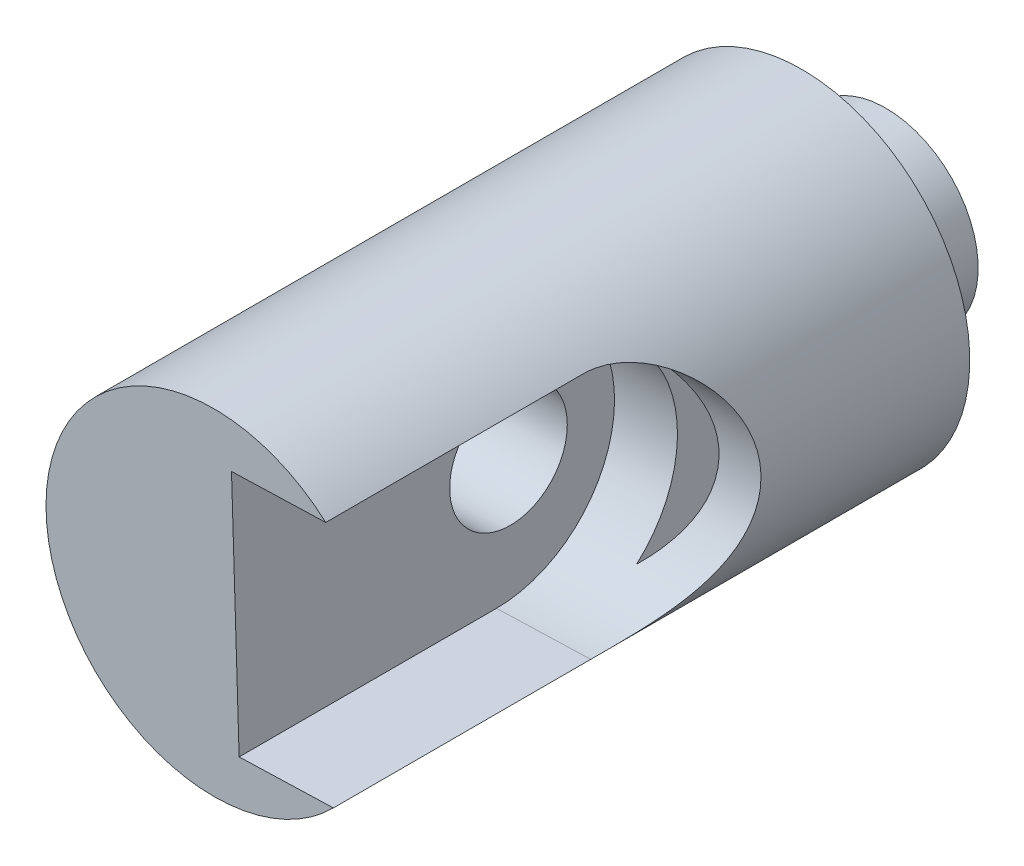
ISO-10303-21;
HEADER;
FILE_DESCRIPTION(('STEP AP214'),'2;1');
FILE_NAME('part.step','',(''),(''),'','','');
FILE_SCHEMA(('AUTOMOTIVE_DESIGN { 1 0 10303 214 1 1 1 1 }'));
ENDSEC;
DATA;
#1=APPLICATION_CONTEXT('core data for automotive mechanical design processes');
#2=APPLICATION_PROTOCOL_DEFINITION('international standard','automotive_design',2000,#1);
#3=PRODUCT_CONTEXT('',#1,'mechanical');
#4=PRODUCT('Part','Part','',(#3));
#5=PRODUCT_RELATED_PRODUCT_CATEGORY('part','',(#4));
#6=PRODUCT_DEFINITION_FORMATION('','',#4);
#7=PRODUCT_DEFINITION_CONTEXT('part definition',#1,'design');
#8=PRODUCT_DEFINITION('design','',#6,#7);
#9=PRODUCT_DEFINITION_SHAPE('','',#8);
#10=(LENGTH_UNIT() NAMED_UNIT(*) SI_UNIT(.MILLI.,.METRE.));
#11=(NAMED_UNIT(*) PLANE_ANGLE_UNIT() SI_UNIT($,.RADIAN.));
#12=(NAMED_UNIT(*) SI_UNIT($,.STERADIAN.) SOLID_ANGLE_UNIT());
#13=UNCERTAINTY_MEASURE_WITH_UNIT(LENGTH_MEASURE(1.E-05),#10,'distance_accuracy_value','');
#14=(GEOMETRIC_REPRESENTATION_CONTEXT(3) GLOBAL_UNCERTAINTY_ASSIGNED_CONTEXT((#13)) GLOBAL_UNIT_ASSIGNED_CONTEXT((#10,
#11,#12)) REPRESENTATION_CONTEXT('',''));
#15=CARTESIAN_POINT('',(0.,0.,0.));
#16=DIRECTION('',(0.,0.,1.));
#17=DIRECTION('',(1.,0.,0.));
#18=AXIS2_PLACEMENT_3D('',#15,#16,#17);
#19=CARTESIAN_POINT('',(0.,0.,20.));
#20=DIRECTION('',(0.,0.,-1.));
#21=DIRECTION('',(-1.,0.,0.));
#22=AXIS2_PLACEMENT_3D('',#19,#20,#21);
#23=CYLINDRICAL_SURFACE('',#22,20.);
#24=CARTESIAN_POINT('',(-20.,0.,44.4453552428067));
#25=CARTESIAN_POINT('',(-20.0000004425085,-0.187842317648547,44.4622486388017));
#26=CARTESIAN_POINT('',(-19.9973479865868,-0.376357770084538,44.4715577425075));
#27=CARTESIAN_POINT('',(-19.9866952425686,-0.753370980419799,44.4749220013045));
#28=CARTESIAN_POINT('',(-19.9786951875228,-0.941868738732161,44.4689778211084));
#29=CARTESIAN_POINT('',(-19.9574482051852,-1.31743445444334,44.4418958961847));
#30=CARTESIAN_POINT('',(-19.9442022247151,-1.5045026636504,44.420760892644));
#31=CARTESIAN_POINT('',(-19.9127024154437,-1.87590448718318,44.3635024894667));
#32=CARTESIAN_POINT('',(-19.8944484825018,-2.0602380445576,44.327378778131));
#33=CARTESIAN_POINT('',(-19.8533327369456,-2.42461292223825,44.2405413125127));
#34=CARTESIAN_POINT('',(-19.830477811978,-2.60466021378754,44.1898493188941));
#35=CARTESIAN_POINT('',(-19.7806169378885,-2.95961626424364,44.0742772385948));
#36=CARTESIAN_POINT('',(-19.7536095353423,-3.13452319832323,44.0093921807725));
#37=CARTESIAN_POINT('',(-19.6960350370607,-3.47800605594235,43.8659880476057));
#38=CARTESIAN_POINT('',(-19.6654685600243,-3.64658307313776,43.7874713407851));
#39=CARTESIAN_POINT('',(-19.6014203644443,-3.97650253583233,43.6173604119971));
#40=CARTESIAN_POINT('',(-19.5679375377582,-4.13784219572114,43.5257612104648));
#41=CARTESIAN_POINT('',(-19.4978570593219,-4.45655780838578,43.3275080150709));
#42=CARTESIAN_POINT('',(-19.4611997578929,-4.61370952767202,43.2205146393983));
#43=CARTESIAN_POINT('',(-19.3864087323906,-4.91851553225404,42.9941239885198));
#44=CARTESIAN_POINT('',(-19.348274504686,-5.06616653130893,42.8747224583573));
#45=CARTESIAN_POINT('',(-19.2714143808507,-5.3511090427189,42.6242857420295));
#46=CARTESIAN_POINT('',(-19.2326884253011,-5.48839950637985,42.4932493810999));
#47=CARTESIAN_POINT('',(-19.1555521145922,-5.75184018205733,42.2203327183977));
#48=CARTESIAN_POINT('',(-19.1171417648495,-5.87799020323072,42.0784522309357));
#49=CARTESIAN_POINT('',(-19.0398333152716,-6.12389655937456,41.7779712628929));
#50=CARTESIAN_POINT('',(-19.0009924994253,-6.24310107158371,41.6189038044488));
#51=CARTESIAN_POINT('',(-18.9257194231206,-6.46770231550239,41.2908468168133));
#52=CARTESIAN_POINT('',(-18.889286326486,-6.57310385345954,41.1218607711526));
#53=CARTESIAN_POINT('',(-18.8198256674173,-6.76941737246106,40.7749235903295));
#54=CARTESIAN_POINT('',(-18.7867991980358,-6.86032470796089,40.5969696048027));
#55=CARTESIAN_POINT('',(-18.7251523904139,-7.02684519909863,40.2333990499313));
#56=CARTESIAN_POINT('',(-18.6965301029811,-7.10246512527972,40.0477859167489));
#57=CARTESIAN_POINT('',(-18.6449800817636,-7.23669866968002,39.6731799048455));
#58=CARTESIAN_POINT('',(-18.6219677447739,-7.29556752629745,39.4842902206943));
#59=CARTESIAN_POINT('',(-18.5817780510421,-7.39733207745742,39.1017274987091));
#60=CARTESIAN_POINT('',(-18.5645982165536,-7.44023455553678,38.90805652965));
#61=CARTESIAN_POINT('',(-18.5366232396813,-7.50966064322653,38.5173813813477));
#62=CARTESIAN_POINT('',(-18.5258268439217,-7.53618746820981,38.3203778642628));
#63=CARTESIAN_POINT('',(-18.510976756472,-7.57259074419938,37.9245890617415));
#64=CARTESIAN_POINT('',(-18.5069227286574,-7.58246802522857,37.7258038656231));
#65=CARTESIAN_POINT('',(-18.5057286987945,-7.58538070824602,37.3396321654185));
#66=CARTESIAN_POINT('',(-18.5082013399477,-7.57935966589449,37.1522532163115));
#67=CARTESIAN_POINT('',(-18.5191755237654,-7.55250613452933,36.7786728258887));
#68=CARTESIAN_POINT('',(-18.52767909289,-7.53166866702293,36.5924718015924));
#69=CARTESIAN_POINT('',(-18.5504587030862,-7.47538626008476,36.2227225198607));
#70=CARTESIAN_POINT('',(-18.564732671348,-7.43994656589368,36.0391733343428));
#71=CARTESIAN_POINT('',(-18.5986419715913,-7.35476820506289,35.6758599496136));
#72=CARTESIAN_POINT('',(-18.6182793341409,-7.30502412243854,35.4960972117624));
#73=CARTESIAN_POINT('',(-18.6622201503578,-7.19202241776985,35.1427160171791));
#74=CARTESIAN_POINT('',(-18.6864937640135,-7.12885093904556,34.9690662522644));
#75=CARTESIAN_POINT('',(-18.7391431340398,-6.98928288868735,34.6277455086868));
#76=CARTESIAN_POINT('',(-18.7675202730567,-6.91288185775364,34.4600765690436));
#77=CARTESIAN_POINT('',(-18.8276441067695,-6.74741152445584,34.1317388391623));
#78=CARTESIAN_POINT('',(-18.8593909167536,-6.65834178861572,33.9710702886972));
#79=CARTESIAN_POINT('',(-18.9254761558097,-6.46811319023259,33.6576134899818));
#80=CARTESIAN_POINT('',(-18.9598147129255,-6.36695373025924,33.5048256317012));
#81=CARTESIAN_POINT('',(-19.0322241059532,-6.14723919678313,33.1997370283242));
#82=CARTESIAN_POINT('',(-19.0703963291228,-6.0280317560531,33.0479297448386));
#83=CARTESIAN_POINT('',(-19.1477532775103,-5.77760421368913,32.7549329341111));
#84=CARTESIAN_POINT('',(-19.1869377038944,-5.64638762908107,32.613740320156));
#85=CARTESIAN_POINT('',(-19.2653954799569,-5.37259928985253,32.3426818628677));
#86=CARTESIAN_POINT('',(-19.3046688680618,-5.23002098494293,32.2128226452069));
#87=CARTESIAN_POINT('',(-19.3823258370079,-4.93444853863428,31.9653794613248));
#88=CARTESIAN_POINT('',(-19.4207097374643,-4.78145821883944,31.8477910309774));
#89=CARTESIAN_POINT('',(-19.4969159976444,-4.46075117757021,31.6219969048384));
#90=CARTESIAN_POINT('',(-19.5346793951948,-4.29271718014562,31.51422129239));
#91=CARTESIAN_POINT('',(-19.6073424782124,-3.94755730983951,31.3134012387409));
#92=CARTESIAN_POINT('',(-19.6422432153564,-3.77043481509384,31.2203513758498));
#93=CARTESIAN_POINT('',(-19.7083208385631,-3.40822165234605,31.0497171116618));
#94=CARTESIAN_POINT('',(-19.7394978141975,-3.22313117615205,30.9721323383365));
#95=CARTESIAN_POINT('',(-19.7973471217223,-2.84629157350414,30.8331385997147));
#96=CARTESIAN_POINT('',(-19.8240196609048,-2.65454275395385,30.7717288899767));
#97=CARTESIAN_POINT('',(-19.8713498027469,-2.27269692777012,30.6675625924604));
#98=CARTESIAN_POINT('',(-19.8921866419919,-2.08278096791077,30.6242235665512));
#99=CARTESIAN_POINT('',(-19.9285917012608,-1.69949508475586,30.553582359667));
#100=CARTESIAN_POINT('',(-19.9441601627417,-1.50612532018061,30.526279443693));
#101=CARTESIAN_POINT('',(-19.9697072641949,-1.11745754217882,30.4879916762449));
#102=CARTESIAN_POINT('',(-19.9796872685388,-0.922160011258233,30.4770028407519));
#103=CARTESIAN_POINT('',(-19.9939035380252,-0.531125242789311,30.4714459366874));
#104=CARTESIAN_POINT('',(-19.9981399689363,-0.335388018094561,30.4768773941859));
#105=CARTESIAN_POINT('',(-20.0008151074168,0.0461301811576558,30.5034841496923));
#106=CARTESIAN_POINT('',(-19.9995078082466,0.231960431698232,30.5239349561457));
#107=CARTESIAN_POINT('',(-19.9918109889907,0.601358751435242,30.5795645073583));
#108=CARTESIAN_POINT('',(-19.9854197879935,0.784926052034582,30.6147481214643));
#109=CARTESIAN_POINT('',(-19.9678309595264,1.14840131829595,30.6995099161634));
#110=CARTESIAN_POINT('',(-19.9566349478322,1.32831049284023,30.7490832559257));
#111=CARTESIAN_POINT('',(-19.9298235043089,1.68340532265036,30.8622222606848));
#112=CARTESIAN_POINT('',(-19.9142064025106,1.85858916558709,30.9257932109499));
#113=CARTESIAN_POINT('',(-19.8788712817774,2.20478030786975,31.0671074906898));
#114=CARTESIAN_POINT('',(-19.859113734394,2.37572815912303,31.1449864626371));
#115=CARTESIAN_POINT('',(-19.816183202839,2.71060774696668,31.3139150383926));
#116=CARTESIAN_POINT('',(-19.793009053564,2.87453706544563,31.4049691348833));
#117=CARTESIAN_POINT('',(-19.7439154497925,3.19436735185186,31.5995909866095));
#118=CARTESIAN_POINT('',(-19.7179958379482,3.3502678588709,31.7031594591155));
#119=CARTESIAN_POINT('',(-19.6641332066412,3.65315358475751,31.9221336628987));
#120=CARTESIAN_POINT('',(-19.636190102185,3.8001384286607,32.0375398914856));
#121=CARTESIAN_POINT('',(-19.5775728854349,4.09168315743354,32.2857143966127));
#122=CARTESIAN_POINT('',(-19.5468322246188,4.23572998265468,32.4190702115792));
#123=CARTESIAN_POINT('',(-19.4848859138111,4.51212570671846,32.6972120316108));
#124=CARTESIAN_POINT('',(-19.4536804084562,4.64447815895493,32.841994539127));
#125=CARTESIAN_POINT('',(-19.3917139869664,4.89676569472088,33.1422413347341));
#126=CARTESIAN_POINT('',(-19.3609533383708,5.01669355309364,33.29771175162));
#127=CARTESIAN_POINT('',(-19.300847988743,5.24318549800075,33.6182693712837));
#128=CARTESIAN_POINT('',(-19.2715027471389,5.34975471172978,33.7833528486139));
#129=CARTESIAN_POINT('',(-19.2145395606266,5.55091281534335,34.1257898058144));
#130=CARTESIAN_POINT('',(-19.186971443992,5.64519971119619,34.3033292512507));
#131=CARTESIAN_POINT('',(-19.1352074494636,5.81824675395876,34.6662134438202));
#132=CARTESIAN_POINT('',(-19.1110102593424,5.89701294771221,34.8515551169247));
#133=CARTESIAN_POINT('',(-19.0668340012976,6.03832146773355,35.228783816917));
#134=CARTESIAN_POINT('',(-19.0468542478962,6.10086643088447,35.4206697742366));
#135=CARTESIAN_POINT('',(-19.0118440355184,6.20910858837416,35.8095765416302));
#136=CARTESIAN_POINT('',(-18.9968132946458,6.25480674232602,36.0065970585494));
#137=CARTESIAN_POINT('',(-18.9728452401336,6.32712610596551,36.3949176531306));
#138=CARTESIAN_POINT('',(-18.963656078456,6.35453875275758,36.5860550183904));
#139=CARTESIAN_POINT('',(-18.9506195510184,6.39331218425049,36.9701293937795));
#140=CARTESIAN_POINT('',(-18.9467719545082,6.40467366234641,37.1630663258068));
#141=CARTESIAN_POINT('',(-18.9445572804337,6.41122149988655,37.5492058994828));
#142=CARTESIAN_POINT('',(-18.946189089437,6.40641114549786,37.742408479176));
#143=CARTESIAN_POINT('',(-18.954871922654,6.38067508095389,38.127611403835));
#144=CARTESIAN_POINT('',(-18.9619228452211,6.35974967306953,38.3196117712826));
#145=CARTESIAN_POINT('',(-18.9807796833874,6.3032407777504,38.6928133698873));
#146=CARTESIAN_POINT('',(-18.9923703385138,6.26831939837363,38.8741263112877));
#147=CARTESIAN_POINT('',(-19.0199178616885,6.18422836461464,39.233139171186));
#148=CARTESIAN_POINT('',(-19.0358761669072,6.13505401999495,39.4108378797118));
#149=CARTESIAN_POINT('',(-19.0716548479018,6.02290962353986,39.7613767260397));
#150=CARTESIAN_POINT('',(-19.0914743540486,5.95994267771157,39.9342179478456));
#151=CARTESIAN_POINT('',(-19.1343877774663,5.82069670661995,40.2741018914461));
#152=CARTESIAN_POINT('',(-19.1574829416179,5.74441260961226,40.4411423749064));
#153=CARTESIAN_POINT('',(-19.2070080731507,5.5766224911515,40.7733498303754));
#154=CARTESIAN_POINT('',(-19.2335176942802,5.48472630668514,40.9383078352385));
#155=CARTESIAN_POINT('',(-19.2885143792602,5.28806557501069,41.260090991388));
#156=CARTESIAN_POINT('',(-19.3170021213477,5.1832966045513,41.4169133206809));
#157=CARTESIAN_POINT('',(-19.3751289649182,4.96160319837589,41.7215086280053));
#158=CARTESIAN_POINT('',(-19.404768165151,4.84467771866269,41.8692808270798));
#159=CARTESIAN_POINT('',(-19.4643631713367,4.59940133378802,42.1549512552404));
#160=CARTESIAN_POINT('',(-19.4943189867116,4.47105008776591,42.2928491895296));
#161=CARTESIAN_POINT('',(-19.555367208684,4.19624851744786,42.5653620592461));
#162=CARTESIAN_POINT('',(-19.5864304355603,4.049189067364,42.699370120428));
#163=CARTESIAN_POINT('',(-19.6470207188208,3.74416133685337,42.9546108035918));
#164=CARTESIAN_POINT('',(-19.6765482718102,3.58619662190869,43.0758475687164));
#165=CARTESIAN_POINT('',(-19.7331789038552,3.26021878628325,43.3048214815837));
#166=CARTESIAN_POINT('',(-19.7602806384983,3.0922001786456,43.4125511566546));
#167=CARTESIAN_POINT('',(-19.8111691286383,2.74735145956625,43.6135799664951));
#168=CARTESIAN_POINT('',(-19.8349572204013,2.57052493930239,43.706884919883));
#169=CARTESIAN_POINT('',(-19.8791917027731,2.20298670980996,43.8812930719595));
#170=CARTESIAN_POINT('',(-19.8994956314593,2.0120068245095,43.9618685199997));
#171=CARTESIAN_POINT('',(-19.9349635513935,1.6233558288528,44.1060179677271));
#172=CARTESIAN_POINT('',(-19.9501296444361,1.42568749110642,44.1695989173007));
#173=CARTESIAN_POINT('',(-19.9747134597499,1.02521095713032,44.2791353504175));
#174=CARTESIAN_POINT('',(-19.9841322668428,0.822403738415282,44.3250941595964));
#175=CARTESIAN_POINT('',(-19.9967749928722,0.413336805960365,44.3988915853585));
#176=CARTESIAN_POINT('',(-19.9999995121784,0.207077428769365,44.4267319578643));
#177=CARTESIAN_POINT('',(-20.,0.,44.4453552428067));
#178=B_SPLINE_CURVE_WITH_KNOTS('',3,(#24,#25,#26,#27,#28,#29,#30,#31,#32,#33,#34,#35,#36,#37,
#38,#39,#40,#41,#42,#43,#44,#45,#46,#47,#48,#49,#50,#51,#52,#53,#54,#55,#56,#57,#58,#59,#60,#61,
#62,#63,#64,#65,#66,#67,#68,#69,#70,#71,#72,#73,#74,#75,#76,#77,#78,#79,#80,#81,#82,#83,#84,#85,
#86,#87,#88,#89,#90,#91,#92,#93,#94,#95,#96,#97,#98,#99,#100,#101,#102,#103,#104,#105,#106,#107,
#108,#109,#110,#111,#112,#113,#114,#115,#116,#117,#118,#119,#120,#121,#122,#123,#124,#125,#126,
#127,#128,#129,#130,#131,#132,#133,#134,#135,#136,#137,#138,#139,#140,#141,#142,#143,#144,#145,
#146,#147,#148,#149,#150,#151,#152,#153,#154,#155,#156,#157,#158,#159,#160,#161,#162,#163,#164,
#165,#166,#167,#168,#169,#170,#171,#172,#173,#174,#175,#176,#177),.UNSPECIFIED.,.T.,.F.,(4,2,2,
2,2,2,2,2,2,2,2,2,2,2,2,2,2,2,2,2,2,2,2,2,2,2,2,2,2,2,2,2,2,2,2,2,2,2,2,2,2,2,2,2,2,2,2,2,2,2,2,
2,2,2,2,2,2,2,2,2,2,2,2,2,2,2,2,2,2,2,2,2,2,2,2,2,4),(0.,0.565612600450699,1.13120055286283,
1.69668647043877,2.26218414821952,2.82684149291637,3.3916969272625,3.95645431498994,
4.52142724096915,5.10163645735189,5.68204529753223,6.26251280815551,6.84299026064206,
7.44987125075371,8.05654035753135,8.66340351895711,9.26999731896564,9.86678171996489,
10.4633122786044,11.0597256706943,11.6561093291519,12.2179044889435,12.7798885077621,
13.341670833016,13.9036661432326,14.4621592978712,15.0208410721742,15.5795419670941,
16.1382704824114,16.7278737052541,17.3173048047135,17.907078217843,18.4966363172065,
19.1053876502428,19.7139143306461,20.3224263705592,20.9309103994065,21.5178934788621,
22.1048496524401,22.6916624633942,23.2784583376475,23.8386669469475,24.3990608573674,
24.9592664643821,25.5196839596929,26.0857176108997,26.6519447349531,27.2182043281335,
27.7844877198992,28.379880941623,28.9750926234791,29.5706485129197,30.1659751169845,
30.7739267835333,31.3816411226133,31.9892566111504,32.5968374838797,33.1760358589708,
33.7552092124834,34.3342648832683,34.9133096929398,35.4676977853836,36.0222685183936,
36.5767144937162,37.1313720884272,37.70278217372,38.2743891547047,38.8460452657296,
39.4177184364781,40.0211166295611,40.6243184671509,41.2278525616566,41.8311425648454,
42.4551078389825,43.0788175512526,43.7024094995433,44.3259410043026),.UNSPECIFIED.);
#179=CARTESIAN_POINT('',(-20.,0.,44.4453552428067));
#180=VERTEX_POINT('',#179);
#181=EDGE_CURVE('E118',#180,#180,#178,.T.);
#182=ORIENTED_EDGE('',*,*,#181,.T.);
#183=EDGE_LOOP('',(#182));
#184=FACE_BOUND('',#183,.T.);
#185=CARTESIAN_POINT('',(0.,0.,0.));
#186=DIRECTION('',(0.,0.,-1.));
#187=DIRECTION('',(-1.,0.,0.));
#188=AXIS2_PLACEMENT_3D('',#185,#186,#187);
#189=CIRCLE('',#188,20.);
#190=CARTESIAN_POINT('',(-20.,0.,0.));
#191=VERTEX_POINT('',#190);
#192=EDGE_CURVE('E164',#191,#191,#189,.T.);
#193=ORIENTED_EDGE('',*,*,#192,.F.);
#194=EDGE_LOOP('',(#193));
#195=FACE_BOUND('',#194,.T.);
#196=DIRECTION('',(0.,0.,-1.));
#197=VECTOR('',#196,1.);
#198=CARTESIAN_POINT('',(13.3134153599734,14.9249111036825,20.));
#199=LINE('',#198,#197);
#200=CARTESIAN_POINT('',(13.3134153599734,14.9249111036825,39.3520492179967));
#201=VERTEX_POINT('',#200);
#202=CARTESIAN_POINT('',(13.3134153599734,14.9249111036825,70.));
#203=VERTEX_POINT('',#202);
#204=EDGE_CURVE('E204',#201,#203,#199,.F.);
#205=ORIENTED_EDGE('',*,*,#204,.F.);
#206=CARTESIAN_POINT('',(14.2229850730889,-14.0608212992944,39.3520492179967));
#207=CARTESIAN_POINT('',(14.2229742516631,-14.0608252162982,39.1788726272704));
#208=CARTESIAN_POINT('',(14.2261536725214,-14.0576169128227,39.0057285004978));
#209=CARTESIAN_POINT('',(14.2387875506655,-14.0448228602102,38.6599292792115));
#210=CARTESIAN_POINT('',(14.2482411193572,-14.0352380141687,38.4872741189236));
#211=CARTESIAN_POINT('',(14.2858043099041,-13.9970406228329,37.9713184520857));
#212=CARTESIAN_POINT('',(14.3231172947011,-13.9589848003908,37.6293065912887));
#213=CARTESIAN_POINT('',(14.4196301427622,-13.8592551180275,36.9562449863149));
#214=CARTESIAN_POINT('',(14.4785654735911,-13.7978664039677,36.6251133755812));
#215=CARTESIAN_POINT('',(14.6154882648255,-13.6527444643762,35.9717147558904));
#216=CARTESIAN_POINT('',(14.6934835322058,-13.5690020814517,35.6494514397315));
#217=CARTESIAN_POINT('',(14.8646329220778,-13.3812809019901,35.0177311526619));
#218=CARTESIAN_POINT('',(14.9576758589029,-13.2774495128835,34.7081996913881));
#219=CARTESIAN_POINT('',(15.1560943983499,-13.0504983933531,34.1004554156212));
#220=CARTESIAN_POINT('',(15.261469004089,-12.9273802217862,33.8022416887884));
#221=CARTESIAN_POINT('',(15.4819160474535,-12.6625450581384,33.2166420512385));
#222=CARTESIAN_POINT('',(15.5970188694741,-12.5207689608864,32.9292944517162));
#223=CARTESIAN_POINT('',(15.8338971861107,-12.219835637883,32.3666901071255));
#224=CARTESIAN_POINT('',(15.9556736623564,-12.0606758517225,32.0914351515532));
#225=CARTESIAN_POINT('',(16.226952382073,-11.6939055001407,31.5021392222547));
#226=CARTESIAN_POINT('',(16.3773301696802,-11.4828325073476,31.1906521944178));
#227=CARTESIAN_POINT('',(16.6803557764098,-11.0380333708868,30.5854648550631));
#228=CARTESIAN_POINT('',(16.8330037668058,-10.8043055106249,30.2917658941185));
#229=CARTESIAN_POINT('',(17.137350205493,-10.3147629113583,29.7225626540737));
#230=CARTESIAN_POINT('',(17.2890481592706,-10.0589375534654,29.4470672361297));
#231=CARTESIAN_POINT('',(17.588387454925,-9.52586484491617,28.915223029932));
#232=CARTESIAN_POINT('',(17.736028488827,-9.2486158739758,28.6588756927511));
#233=CARTESIAN_POINT('',(18.051110200722,-8.6199107573052,28.1207693386892));
#234=CARTESIAN_POINT('',(18.2171504665529,-8.2642235617562,27.8431032444655));
#235=CARTESIAN_POINT('',(18.5348800140265,-7.52464136141697,27.3185601990681));
#236=CARTESIAN_POINT('',(18.6865663617751,-7.14074061823613,27.0716895391131));
#237=CARTESIAN_POINT('',(18.9707971749197,-6.34714179324637,26.6121072303389));
#238=CARTESIAN_POINT('',(19.1033721651489,-5.93748638460798,26.3993410472971));
#239=CARTESIAN_POINT('',(19.3452417342202,-5.09447125889797,26.0108958807035));
#240=CARTESIAN_POINT('',(19.4545474925083,-4.6611230511179,25.8351990879348));
#241=CARTESIAN_POINT('',(19.6185518858174,-3.9009759335107,25.568663680394));
#242=CARTESIAN_POINT('',(19.6799327735312,-3.57905313922842,25.4679162542034));
#243=CARTESIAN_POINT('',(19.7874604748604,-2.92670355892603,25.2882709116741));
#244=CARTESIAN_POINT('',(19.8336107142168,-2.59627870327357,25.2093680826014));
#245=CARTESIAN_POINT('',(19.9095707486004,-1.92915246853047,25.0744870176294));
#246=CARTESIAN_POINT('',(19.9393913988023,-1.5924554132407,25.0184935588891));
#247=CARTESIAN_POINT('',(19.9819474114525,-0.914875357930566,24.9301555586054));
#248=CARTESIAN_POINT('',(19.9946821773973,-0.573992212184425,24.8978118427413));
#249=CARTESIAN_POINT('',(20.0026289283924,0.110198189156131,24.8572232408401));
#250=CARTESIAN_POINT('',(19.9978008380042,0.453509202504801,24.8490335472916));
#251=CARTESIAN_POINT('',(19.9704799472305,1.13913987140963,24.8570379617273));
#252=CARTESIAN_POINT('',(19.9479872144359,1.48145953075402,24.8732319764112));
#253=CARTESIAN_POINT('',(19.8856795076763,2.16257607902138,24.9297571152173));
#254=CARTESIAN_POINT('',(19.8458607239327,2.50137217637208,24.9700935486837));
#255=CARTESIAN_POINT('',(19.7496244905673,3.1729163806598,25.0743015337017));
#256=CARTESIAN_POINT('',(19.6932070864884,3.50566450418848,25.1381730206784));
#257=CARTESIAN_POINT('',(19.5666553418221,4.15353206016148,25.2864010004799));
#258=CARTESIAN_POINT('',(19.4969584479696,4.46888358065249,25.3701208093543));
#259=CARTESIAN_POINT('',(19.3440778699862,5.09008591124062,25.5579003160905));
#260=CARTESIAN_POINT('',(19.2608945367896,5.39593696830518,25.6619594847108));
#261=CARTESIAN_POINT('',(19.0823814799642,5.99674420444995,25.8892977578089));
#262=CARTESIAN_POINT('',(18.9870512984494,6.29169997228178,26.0125775868654));
#263=CARTESIAN_POINT('',(18.7856842805064,6.8696239310993,26.2772053175312));
#264=CARTESIAN_POINT('',(18.6796459983576,7.15259049605957,26.4185556595611));
#265=CARTESIAN_POINT('',(18.4461230744592,7.73627632375103,26.7347681184986));
#266=CARTESIAN_POINT('',(18.3175637190501,8.03549423329144,26.9116077613891));
#267=CARTESIAN_POINT('',(18.0512033154427,8.61721678906266,27.284711766236));
#268=CARTESIAN_POINT('',(17.9134016878586,8.89972038540185,27.4809773463464));
#269=CARTESIAN_POINT('',(17.630576567516,9.44763936888886,27.8918002459784));
#270=CARTESIAN_POINT('',(17.4855476497817,9.71304156596976,28.1063713947928));
#271=CARTESIAN_POINT('',(17.190514911579,10.226133072023,28.5525969011265));
#272=CARTESIAN_POINT('',(17.0405106317487,10.4738207387598,28.7842528384677));
#273=CARTESIAN_POINT('',(16.709214005781,10.9961328493966,29.3089375340305));
#274=CARTESIAN_POINT('',(16.5273492479327,11.2670460803354,29.6053085376159));
#275=CARTESIAN_POINT('',(16.1635848960846,11.7829609653443,30.2198816395311));
#276=CARTESIAN_POINT('',(15.9816853025189,12.0279573406128,30.5380881636903));
#277=CARTESIAN_POINT('',(15.6220366064849,12.4915198461408,31.1957632334522));
#278=CARTESIAN_POINT('',(15.4442899662063,12.7100706029458,31.5352439738678));
#279=CARTESIAN_POINT('',(15.0979039524274,13.1196485337919,32.234780466507));
#280=CARTESIAN_POINT('',(14.9292620615335,13.310683340401,32.5948304742303));
#281=CARTESIAN_POINT('',(14.6418180167776,13.625424708758,33.2543626297598));
#282=CARTESIAN_POINT('',(14.5201652980134,13.7547301163222,33.5499377150378));
#283=CARTESIAN_POINT('',(14.288841374921,13.9948849174948,34.153105935016));
#284=CARTESIAN_POINT('',(14.1791701415475,14.1057343558443,34.4606990405799));
#285=CARTESIAN_POINT('',(13.9755340756635,14.3075130933872,35.0859909170404));
#286=CARTESIAN_POINT('',(13.8815092819848,14.3985188753983,35.4036452819232));
#287=CARTESIAN_POINT('',(13.7121087237221,14.5599383579117,36.0489875042493));
#288=CARTESIAN_POINT('',(13.636725945892,14.6303598041934,36.3766715361709));
#289=CARTESIAN_POINT('',(13.530576381928,14.7284320619454,36.9232407815772));
#290=CARTESIAN_POINT('',(13.4934476604954,14.7624104905191,37.1397834498503));
#291=CARTESIAN_POINT('',(13.4291383916239,14.8209355051492,37.5755721503367));
#292=CARTESIAN_POINT('',(13.4019553661671,14.8454844406852,37.7948174950734));
#293=CARTESIAN_POINT('',(13.3580313721728,14.8850236341804,38.2364902437317));
#294=CARTESIAN_POINT('',(13.3413509504038,14.8999584784369,38.4589286712042));
#295=CARTESIAN_POINT('',(13.3190165356937,14.9199141789906,38.9049207788461));
#296=CARTESIAN_POINT('',(13.3133685835636,14.9249296039442,39.1284750028477));
#297=CARTESIAN_POINT('',(13.3134153599734,14.9249111036825,39.3520492179967));
#298=B_SPLINE_CURVE_WITH_KNOTS('',3,(#206,#207,#208,#209,#210,#211,#212,#213,#214,#215,#216,
#217,#218,#219,#220,#221,#222,#223,#224,#225,#226,#227,#228,#229,#230,#231,#232,#233,#234,#235,
#236,#237,#238,#239,#240,#241,#242,#243,#244,#245,#246,#247,#248,#249,#250,#251,#252,#253,#254,
#255,#256,#257,#258,#259,#260,#261,#262,#263,#264,#265,#266,#267,#268,#269,#270,#271,#272,#273,
#274,#275,#276,#277,#278,#279,#280,#281,#282,#283,#284,#285,#286,#287,#288,#289,#290,#291,#292,
#293,#294,#295,#296,#297),.UNSPECIFIED.,.F.,.F.,(4,2,2,2,2,2,2,2,2,2,2,2,2,2,2,2,2,2,2,2,2,2,2,
2,2,2,2,2,2,2,2,2,2,2,2,2,2,2,2,2,2,2,2,2,2,4),(0.,0.519407972214374,1.03874239749123,
2.07525816212434,3.09949424911307,4.12415056980012,5.14155538891397,6.15887801853061,
7.17950462842517,8.20028176762573,9.41479831547594,10.6294069611648,11.8446025657359,
13.0598901665876,14.5003660484162,15.9411357257179,17.379578071387,18.8173277657854,
19.8448692811406,20.8721795197969,21.8988060173251,22.9254683555656,23.9544748299128,
24.9834773669505,26.0127062830113,27.0419323751205,28.0417836491429,29.041608909939,
30.0414718711791,31.0414700067257,32.1521448992466,33.2628894837091,34.3744807609878,
35.4861749557429,36.8072208344566,38.1285352706726,39.4506141647764,40.7723256221458,
41.8059061831243,42.8394842384557,43.8690052841747,44.8981384262306,45.5646930402377,
46.2310814656806,46.9012772215338,47.5718398392561),.UNSPECIFIED.);
#299=CARTESIAN_POINT('',(14.2229850730889,-14.0608212992944,39.3520492179967));
#300=VERTEX_POINT('',#299);
#301=EDGE_CURVE('E103',#300,#201,#298,.T.);
#302=ORIENTED_EDGE('',*,*,#301,.F.);
#303=DIRECTION('',(0.,0.,-1.));
#304=VECTOR('',#303,1.);
#305=CARTESIAN_POINT('',(14.2229850730889,-14.0608212992944,20.));
#306=LINE('',#305,#304);
#307=CARTESIAN_POINT('',(14.2229850730889,-14.0608212992944,70.));
#308=VERTEX_POINT('',#307);
#309=EDGE_CURVE('E143',#308,#300,#306,.T.);
#310=ORIENTED_EDGE('',*,*,#309,.F.);
#311=CARTESIAN_POINT('',(0.,0.,70.));
#312=DIRECTION('',(0.,0.,1.));
#313=DIRECTION('',(1.,0.,0.));
#314=AXIS2_PLACEMENT_3D('',#311,#312,#313);
#315=CIRCLE('',#314,20.);
#316=EDGE_CURVE('E207',#203,#308,#315,.T.);
#317=ORIENTED_EDGE('',*,*,#316,.F.);
#318=EDGE_LOOP('',(#205,#302,#310,#317));
#319=FACE_BOUND('',#318,.T.);
#320=ADVANCED_FACE('F43',(#184,#195,#319),#23,.T.);
#321=CARTESIAN_POINT('',(0.,0.,70.));
#322=DIRECTION('',(0.,0.,1.));
#323=DIRECTION('',(1.,0.,0.));
#324=AXIS2_PLACEMENT_3D('',#321,#322,#323);
#325=PLANE('',#324);
#326=DIRECTION('',(-0.0313644728660499,0.999508013895754,0.));
#327=VECTOR('',#326,1.);
#328=CARTESIAN_POINT('',(2.54363174702146,0.0798189387193831,70.));
#329=LINE('',#328,#327);
#330=CARTESIAN_POINT('',(2.99841660357918,-14.4130472627691,70.));
#331=VERTEX_POINT('',#330);
#332=CARTESIAN_POINT('',(2.08884689046374,14.5726851402078,70.));
#333=VERTEX_POINT('',#332);
#334=EDGE_CURVE('E163',#331,#333,#329,.T.);
#335=ORIENTED_EDGE('',*,*,#334,.T.);
#336=DIRECTION('',(0.999508013895754,0.0313644728660499,0.));
#337=VECTOR('',#336,1.);
#338=CARTESIAN_POINT('',(-0.454784856557723,14.4928662014884,70.));
#339=LINE('',#338,#337);
#340=EDGE_CURVE('E11',#333,#203,#339,.T.);
#341=ORIENTED_EDGE('',*,*,#340,.T.);
#342=ORIENTED_EDGE('',*,*,#316,.T.);
#343=DIRECTION('',(-0.999508013895754,-0.0313644728660499,0.));
#344=VECTOR('',#343,1.);
#345=CARTESIAN_POINT('',(0.454784856557723,-14.4928662014884,70.));
#346=LINE('',#345,#344);
#347=EDGE_CURVE('E52',#308,#331,#346,.T.);
#348=ORIENTED_EDGE('',*,*,#347,.T.);
#349=EDGE_LOOP('',(#335,#341,#342,#348));
#350=FACE_BOUND('',#349,.T.);
#351=ADVANCED_FACE('F176',(#350),#325,.T.);
#352=CARTESIAN_POINT('',(0.,0.,0.));
#353=DIRECTION('',(0.,0.,-1.));
#354=DIRECTION('',(-1.,0.,0.));
#355=AXIS2_PLACEMENT_3D('',#352,#353,#354);
#356=PLANE('',#355);
#357=CARTESIAN_POINT('',(0.,0.,0.));
#358=DIRECTION('',(0.,0.,-1.));
#359=DIRECTION('',(-1.,0.,0.));
#360=AXIS2_PLACEMENT_3D('',#357,#358,#359);
#361=CIRCLE('',#360,11.);
#362=CARTESIAN_POINT('',(-11.,0.,0.));
#363=VERTEX_POINT('',#362);
#364=EDGE_CURVE('E230',#363,#363,#361,.T.);
#365=ORIENTED_EDGE('',*,*,#364,.F.);
#366=EDGE_LOOP('',(#365));
#367=FACE_BOUND('',#366,.T.);
#368=ORIENTED_EDGE('',*,*,#192,.T.);
#369=EDGE_LOOP('',(#368));
#370=FACE_BOUND('',#369,.T.);
#371=ADVANCED_FACE('F179',(#367,#370),#356,.T.);
#372=CARTESIAN_POINT('',(0.,0.,0.));
#373=DIRECTION('',(0.,0.,-1.));
#374=DIRECTION('',(-1.,0.,0.));
#375=AXIS2_PLACEMENT_3D('',#372,#373,#374);
#376=CYLINDRICAL_SURFACE('',#375,11.);
#377=ORIENTED_EDGE('',*,*,#364,.T.);
#378=EDGE_LOOP('',(#377));
#379=FACE_BOUND('',#378,.T.);
#380=CARTESIAN_POINT('',(0.,0.,-10.));
#381=DIRECTION('',(0.,0.,-1.));
#382=DIRECTION('',(-1.,0.,0.));
#383=AXIS2_PLACEMENT_3D('',#380,#381,#382);
#384=CIRCLE('',#383,11.);
#385=CARTESIAN_POINT('',(-11.,0.,-10.));
#386=VERTEX_POINT('',#385);
#387=EDGE_CURVE('E229',#386,#386,#384,.T.);
#388=ORIENTED_EDGE('',*,*,#387,.F.);
#389=EDGE_LOOP('',(#388));
#390=FACE_BOUND('',#389,.T.);
#391=ADVANCED_FACE('F181',(#379,#390),#376,.T.);
#392=CARTESIAN_POINT('',(0.,0.,-10.));
#393=DIRECTION('',(0.,0.,1.));
#394=DIRECTION('',(1.,0.,0.));
#395=AXIS2_PLACEMENT_3D('',#392,#393,#394);
#396=PLANE('',#395);
#397=ORIENTED_EDGE('',*,*,#387,.T.);
#398=EDGE_LOOP('',(#397));
#399=FACE_BOUND('',#398,.T.);
#400=ADVANCED_FACE('F184',(#399),#396,.F.);
#401=CARTESIAN_POINT('',(20.1525213799036,15.1395216442764,39.3520492179967));
#402=DIRECTION('',(0.0313644728660499,-0.999508013895754,0.));
#403=DIRECTION('',(0.999508013895754,0.0313644728660499,0.));
#404=AXIS2_PLACEMENT_3D('',#401,#402,#403);
#405=PLANE('',#404);
#406=ORIENTED_EDGE('',*,*,#204,.T.);
#407=ORIENTED_EDGE('',*,*,#340,.F.);
#408=DIRECTION('',(0.,0.,1.));
#409=VECTOR('',#408,1.);
#410=CARTESIAN_POINT('',(2.08884689046373,14.5726851402078,39.3520492179967));
#411=LINE('',#410,#409);
#412=CARTESIAN_POINT('',(2.08884689046373,14.5726851402078,39.3520492179967));
#413=VERTEX_POINT('',#412);
#414=EDGE_CURVE('E59',#413,#333,#411,.T.);
#415=ORIENTED_EDGE('',*,*,#414,.F.);
#416=DIRECTION('',(-0.999508013895754,-0.0313644728660499,0.));
#417=VECTOR('',#416,1.);
#418=CARTESIAN_POINT('',(20.1525213799036,15.1395216442764,39.3520492179967));
#419=LINE('',#418,#417);
#420=EDGE_CURVE('E98',#201,#413,#419,.T.);
#421=ORIENTED_EDGE('',*,*,#420,.F.);
#422=EDGE_LOOP('',(#406,#407,#415,#421));
#423=FACE_BOUND('',#422,.T.);
#424=ADVANCED_FACE('F109',(#423),#405,.T.);
#425=CARTESIAN_POINT('',(21.0620910930191,-13.8462107587005,72.5990552994092));
#426=DIRECTION('',(-0.0313644728660499,0.999508013895754,0.));
#427=DIRECTION('',(-0.999508013895754,-0.0313644728660499,0.));
#428=AXIS2_PLACEMENT_3D('',#425,#426,#427);
#429=PLANE('',#428);
#430=ORIENTED_EDGE('',*,*,#309,.T.);
#431=DIRECTION('',(-0.999508013895754,-0.0313644728660499,0.));
#432=VECTOR('',#431,1.);
#433=CARTESIAN_POINT('',(21.0620910930191,-13.8462107587005,39.3520492179967));
#434=LINE('',#433,#432);
#435=CARTESIAN_POINT('',(2.99841660357918,-14.4130472627691,39.3520492179967));
#436=VERTEX_POINT('',#435);
#437=EDGE_CURVE('E107',#300,#436,#434,.T.);
#438=ORIENTED_EDGE('',*,*,#437,.T.);
#439=DIRECTION('',(0.,0.,-1.));
#440=VECTOR('',#439,1.);
#441=CARTESIAN_POINT('',(2.99841660357918,-14.4130472627691,72.5990552994092));
#442=LINE('',#441,#440);
#443=EDGE_CURVE('E112',#331,#436,#442,.T.);
#444=ORIENTED_EDGE('',*,*,#443,.F.);
#445=ORIENTED_EDGE('',*,*,#347,.F.);
#446=EDGE_LOOP('',(#430,#438,#444,#445));
#447=FACE_BOUND('',#446,.T.);
#448=ADVANCED_FACE('F149',(#447),#429,.T.);
#449=CARTESIAN_POINT('',(20.6073062364614,0.646655442787959,39.3520492179967));
#450=DIRECTION('',(-0.999508013895754,-0.0313644728660499,0.));
#451=DIRECTION('',(0.0313644728660499,-0.999508013895754,0.));
#452=AXIS2_PLACEMENT_3D('',#449,#450,#451);
#453=CYLINDRICAL_SURFACE('',#452,14.5);
#454=CARTESIAN_POINT('',(10.0399418512396,0.315052485214757,39.3520492179967));
#455=DIRECTION('',(-0.999508013895754,-0.0313644728660499,0.));
#456=DIRECTION('',(0.0313644728660499,-0.999508013895754,0.));
#457=AXIS2_PLACEMENT_3D('',#454,#455,#456);
#458=CIRCLE('',#457,14.5);
#459=CARTESIAN_POINT('',(10.3893430778361,-10.8194986210553,30.0703634635277));
#460=VERTEX_POINT('',#459);
#461=CARTESIAN_POINT('',(9.69054062464306,11.4496035914848,30.0703634635277));
#462=VERTEX_POINT('',#461);
#463=EDGE_CURVE('E66',#460,#462,#458,.F.);
#464=ORIENTED_EDGE('',*,*,#463,.T.);
#465=CARTESIAN_POINT('',(9.69054062464306,11.4496035914848,30.0703634635277));
#466=CARTESIAN_POINT('',(9.82666244817262,11.3343925642619,29.9270357285307));
#467=CARTESIAN_POINT('',(9.96175986088972,11.2158863992432,29.7854054303606));
#468=CARTESIAN_POINT('',(10.2296080722843,10.9721432787844,29.5057143702329));
#469=CARTESIAN_POINT('',(10.3623585447475,10.8469053972892,29.3676541032791));
#470=CARTESIAN_POINT('',(10.7569862227222,10.4605412728536,28.9587351445749));
#471=CARTESIAN_POINT('',(11.014823916583,10.1891140259915,28.6935752362579));
#472=CARTESIAN_POINT('',(11.519053791896,9.61554121627125,28.1783770923735));
#473=CARTESIAN_POINT('',(11.7653131993469,9.31312712022595,27.9285073952001));
#474=CARTESIAN_POINT('',(12.2402005094561,8.67951892671739,27.4497042606305));
#475=CARTESIAN_POINT('',(12.4688406898536,8.34834521864551,27.2207562231787));
#476=CARTESIAN_POINT('',(12.8531273669933,7.73914311183193,26.8385201795193));
#477=CARTESIAN_POINT('',(13.0132370282034,7.46710290766377,26.6801548152105));
#478=CARTESIAN_POINT('',(13.3191710561277,6.90663301873795,26.3792997273668));
#479=CARTESIAN_POINT('',(13.4649957336897,6.61820369083096,26.236809658369));
#480=CARTESIAN_POINT('',(13.7399429711051,6.02660991486292,25.9700032569488));
#481=CARTESIAN_POINT('',(13.8691148627641,5.72349282810938,25.8456330971412));
#482=CARTESIAN_POINT('',(14.1092467284711,5.10292313797545,25.6164838447916));
#483=CARTESIAN_POINT('',(14.2202068718883,4.78547066794919,25.5117045700532));
#484=CARTESIAN_POINT('',(14.4229912168636,4.13457503604427,25.3226385755206));
#485=CARTESIAN_POINT('',(14.5146021456695,3.80099892239371,25.2385786978762));
#486=CARTESIAN_POINT('',(14.6753374453799,3.12340911516765,25.0941560248392));
#487=CARTESIAN_POINT('',(14.7444615375613,2.77939529227511,25.0337935231723));
#488=CARTESIAN_POINT('',(14.8587021199721,2.08400901669199,24.938175591725));
#489=CARTESIAN_POINT('',(14.9038230084028,1.73263792437504,24.9029155619192));
#490=CARTESIAN_POINT('',(14.9690758651794,1.0259691346061,24.8583685646683));
#491=CARTESIAN_POINT('',(14.9892116650169,0.670672047642986,24.8490776145616));
#492=CARTESIAN_POINT('',(15.0030780132599,0.0113727064594625,24.8561319868201));
#493=CARTESIAN_POINT('',(15.0002103324269,-0.292606311078304,24.8689594470152));
#494=CARTESIAN_POINT('',(14.9761381562237,-0.8984148026528,24.9135134054913));
#495=CARTESIAN_POINT('',(14.9549358032156,-1.20024452367535,24.9452376955886));
#496=CARTESIAN_POINT('',(14.8947093157134,-1.79953651597291,25.0270051744362));
#497=CARTESIAN_POINT('',(14.8556883564258,-2.09699955563023,25.0770450990962));
#498=CARTESIAN_POINT('',(14.7606243867407,-2.68567955758948,25.1945941239652));
#499=CARTESIAN_POINT('',(14.7045806417143,-2.97689624974555,25.2621039780813));
#500=CARTESIAN_POINT('',(14.577058952465,-3.54886724561697,25.412863560585));
#501=CARTESIAN_POINT('',(14.505721828265,-3.82969128023201,25.4959688706901));
#502=CARTESIAN_POINT('',(14.3484335082894,-4.38235595755093,25.6771799387861));
#503=CARTESIAN_POINT('',(14.2624767879472,-4.65419315768702,25.7752913659882));
#504=CARTESIAN_POINT('',(14.0771356727798,-5.18787804697033,25.9853277457352));
#505=CARTESIAN_POINT('',(13.977745956682,-5.44972172435648,26.0972581709335));
#506=CARTESIAN_POINT('',(13.766777719255,-5.96261397042298,26.3337095274967));
#507=CARTESIAN_POINT('',(13.6551966149095,-6.21366023566839,26.4582331265876));
#508=CARTESIAN_POINT('',(13.364541210908,-6.82286311015581,26.7815653060736));
#509=CARTESIAN_POINT('',(13.1788740633998,-7.17426931240167,26.9872312672386));
#510=CARTESIAN_POINT('',(12.7870323015939,-7.85143222750556,27.4202603686293));
#511=CARTESIAN_POINT('',(12.5808475469789,-8.17717611348364,27.6476342351724));
#512=CARTESIAN_POINT('',(12.151292587488,-8.80284875358853,28.121110462247));
#513=CARTESIAN_POINT('',(11.9279152740773,-9.10276671980897,28.3672205691104));
#514=CARTESIAN_POINT('',(11.4671444166256,-9.6767748643737,28.875493512311));
#515=CARTESIAN_POINT('',(11.2297574550873,-9.95087701770523,29.1376488118487));
#516=CARTESIAN_POINT('',(10.8887768975695,-10.3177150655766,29.5153268118112));
#517=CARTESIAN_POINT('',(10.7899023946873,-10.4210469317733,29.6249692498347));
#518=CARTESIAN_POINT('',(10.5907170809282,-10.6234086562416,29.846181822421));
#519=CARTESIAN_POINT('',(10.4904103634149,-10.7224483964393,29.9577466004923));
#520=CARTESIAN_POINT('',(10.3893430778361,-10.8194986210554,30.0703634635276));
#521=B_SPLINE_CURVE_WITH_KNOTS('',3,(#465,#466,#467,#468,#469,#470,#471,#472,#473,#474,#475,
#476,#477,#478,#479,#480,#481,#482,#483,#484,#485,#486,#487,#488,#489,#490,#491,#492,#493,#494,
#495,#496,#497,#498,#499,#500,#501,#502,#503,#504,#505,#506,#507,#508,#509,#510,#511,#512,#513,
#514,#515,#516,#517,#518,#519,#520),.UNSPECIFIED.,.F.,.F.,(4,2,2,2,2,2,2,2,2,2,2,2,2,2,2,2,2,2,
2,2,2,2,2,2,2,2,2,4),(0.,0.686309626819708,1.37271390932987,2.74760898227861,4.13563043248816,
5.5226757426731,6.58123274784596,7.63976671321987,8.69508909193608,9.75040165559391,
10.8168005074851,11.8832125768276,12.9494291759286,14.0154822492879,14.9271460445379,
15.8387033284676,16.7500982397716,17.6615324884848,18.5649095402544,19.4686287287406,
20.3727069665957,21.2769771263119,22.6174640036241,23.9586167050394,25.3003269372779,
26.641411703203,27.1819864326519,27.7212421279755),.UNSPECIFIED.);
#522=EDGE_CURVE('E155',#462,#460,#521,.T.);
#523=ORIENTED_EDGE('',*,*,#522,.T.);
#524=EDGE_LOOP('',(#464,#523));
#525=FACE_BOUND('',#524,.T.);
#526=ORIENTED_EDGE('',*,*,#301,.T.);
#527=ORIENTED_EDGE('',*,*,#420,.T.);
#528=CARTESIAN_POINT('',(2.54363174702146,0.0798189387193831,39.3520492179967));
#529=DIRECTION('',(0.999508013895754,0.0313644728660499,0.));
#530=DIRECTION('',(-0.0313644728660499,0.999508013895754,0.));
#531=AXIS2_PLACEMENT_3D('',#528,#529,#530);
#532=CIRCLE('',#531,14.5);
#533=EDGE_CURVE('E101',#436,#413,#532,.T.);
#534=ORIENTED_EDGE('',*,*,#533,.F.);
#535=ORIENTED_EDGE('',*,*,#437,.F.);
#536=EDGE_LOOP('',(#526,#527,#534,#535));
#537=FACE_BOUND('',#536,.T.);
#538=ADVANCED_FACE('F99',(#525,#537),#453,.F.);
#539=CARTESIAN_POINT('',(2.54363174702146,0.0798189387193831,39.3520492179967));
#540=DIRECTION('',(0.999508013895754,0.0313644728660499,0.));
#541=DIRECTION('',(-0.0313644728660499,0.999508013895754,0.));
#542=AXIS2_PLACEMENT_3D('',#539,#540,#541);
#543=PLANE('',#542);
#544=CARTESIAN_POINT('',(2.54363174702146,0.0798189387193832,37.4735184735806));
#545=DIRECTION('',(0.999508013895754,0.0313644728660499,0.));
#546=DIRECTION('',(-0.0313644728660499,0.999508013895754,0.));
#547=AXIS2_PLACEMENT_3D('',#544,#545,#546);
#548=CIRCLE('',#547,7.);
#549=CARTESIAN_POINT('',(2.32408043695911,7.07637503598966,37.4735184735806));
#550=VERTEX_POINT('',#549);
#551=EDGE_CURVE('E122',#550,#550,#548,.T.);
#552=ORIENTED_EDGE('',*,*,#551,.F.);
#553=EDGE_LOOP('',(#552));
#554=FACE_BOUND('',#553,.T.);
#555=ORIENTED_EDGE('',*,*,#443,.T.);
#556=ORIENTED_EDGE('',*,*,#533,.T.);
#557=ORIENTED_EDGE('',*,*,#414,.T.);
#558=ORIENTED_EDGE('',*,*,#334,.F.);
#559=EDGE_LOOP('',(#555,#556,#557,#558));
#560=FACE_BOUND('',#559,.T.);
#561=ADVANCED_FACE('F114',(#554,#560),#543,.T.);
#562=CARTESIAN_POINT('',(0.,0.,20.));
#563=DIRECTION('',(0.,0.,1.));
#564=DIRECTION('',(1.,0.,0.));
#565=AXIS2_PLACEMENT_3D('',#562,#563,#564);
#566=PLANE('',#565);
#567=DIRECTION('',(0.0313644728660499,-0.999508013895754,0.));
#568=VECTOR('',#567,1.);
#569=CARTESIAN_POINT('',(10.0399418512396,0.315052485214757,20.));
#570=LINE('',#569,#568);
#571=CARTESIAN_POINT('',(9.69054062464306,11.4496035914848,20.));
#572=VERTEX_POINT('',#571);
#573=CARTESIAN_POINT('',(10.3893430778362,-10.8194986210553,20.));
#574=VERTEX_POINT('',#573);
#575=EDGE_CURVE('E209',#572,#574,#570,.T.);
#576=ORIENTED_EDGE('',*,*,#575,.T.);
#577=CARTESIAN_POINT('',(0.,0.,20.));
#578=DIRECTION('',(0.,0.,1.));
#579=DIRECTION('',(1.,0.,0.));
#580=AXIS2_PLACEMENT_3D('',#577,#578,#579);
#581=CIRCLE('',#580,15.);
#582=EDGE_CURVE('E213',#574,#572,#581,.T.);
#583=ORIENTED_EDGE('',*,*,#582,.T.);
#584=EDGE_LOOP('',(#576,#583));
#585=FACE_BOUND('',#584,.T.);
#586=ADVANCED_FACE('F151',(#585),#566,.T.);
#587=CARTESIAN_POINT('',(0.,0.,20.));
#588=DIRECTION('',(0.,0.,1.));
#589=DIRECTION('',(1.,0.,0.));
#590=AXIS2_PLACEMENT_3D('',#587,#588,#589);
#591=CYLINDRICAL_SURFACE('',#590,15.);
#592=ORIENTED_EDGE('',*,*,#522,.F.);
#593=DIRECTION('',(0.,0.,1.));
#594=VECTOR('',#593,1.);
#595=CARTESIAN_POINT('',(9.69054062464306,11.4496035914848,20.));
#596=LINE('',#595,#594);
#597=EDGE_CURVE('E220',#572,#462,#596,.T.);
#598=ORIENTED_EDGE('',*,*,#597,.F.);
#599=ORIENTED_EDGE('',*,*,#582,.F.);
#600=DIRECTION('',(0.,0.,1.));
#601=VECTOR('',#600,1.);
#602=CARTESIAN_POINT('',(10.3893430778362,-10.8194986210553,20.));
#603=LINE('',#602,#601);
#604=EDGE_CURVE('E219',#574,#460,#603,.T.);
#605=ORIENTED_EDGE('',*,*,#604,.T.);
#606=EDGE_LOOP('',(#592,#598,#599,#605));
#607=FACE_BOUND('',#606,.T.);
#608=ADVANCED_FACE('F166',(#607),#591,.F.);
#609=CARTESIAN_POINT('',(10.0399418512396,0.315052485214757,20.));
#610=DIRECTION('',(-0.999508013895754,-0.0313644728660499,0.));
#611=DIRECTION('',(0.0313644728660499,-0.999508013895754,0.));
#612=AXIS2_PLACEMENT_3D('',#609,#610,#611);
#613=PLANE('',#612);
#614=ORIENTED_EDGE('',*,*,#463,.F.);
#615=ORIENTED_EDGE('',*,*,#604,.F.);
#616=ORIENTED_EDGE('',*,*,#575,.F.);
#617=ORIENTED_EDGE('',*,*,#597,.T.);
#618=EDGE_LOOP('',(#614,#615,#616,#617));
#619=FACE_BOUND('',#618,.T.);
#620=ADVANCED_FACE('F170',(#619),#613,.F.);
#621=CARTESIAN_POINT('',(-20.6073062364614,-0.64665544278796,37.4735184735806));
#622=DIRECTION('',(0.999508013895754,0.0313644728660499,0.));
#623=DIRECTION('',(-0.0313644728660499,0.999508013895754,0.));
#624=AXIS2_PLACEMENT_3D('',#621,#622,#623);
#625=CYLINDRICAL_SURFACE('',#624,7.);
#626=ORIENTED_EDGE('',*,*,#551,.T.);
#627=EDGE_LOOP('',(#626));
#628=FACE_BOUND('',#627,.T.);
#629=ORIENTED_EDGE('',*,*,#181,.F.);
#630=EDGE_LOOP('',(#629));
#631=FACE_BOUND('',#630,.T.);
#632=ADVANCED_FACE('F174',(#628,#631),#625,.F.);
#633=CLOSED_SHELL('',(#320,#351,#371,#391,#400,#424,#448,#538,#561,#586,#608,#620,#632));
#634=MANIFOLD_SOLID_BREP('B2',#633);
#635=ADVANCED_BREP_SHAPE_REPRESENTATION('',(#18,#634),#14);
#636=SHAPE_DEFINITION_REPRESENTATION(#9,#635);
ENDSEC;
END-ISO-10303-21;
